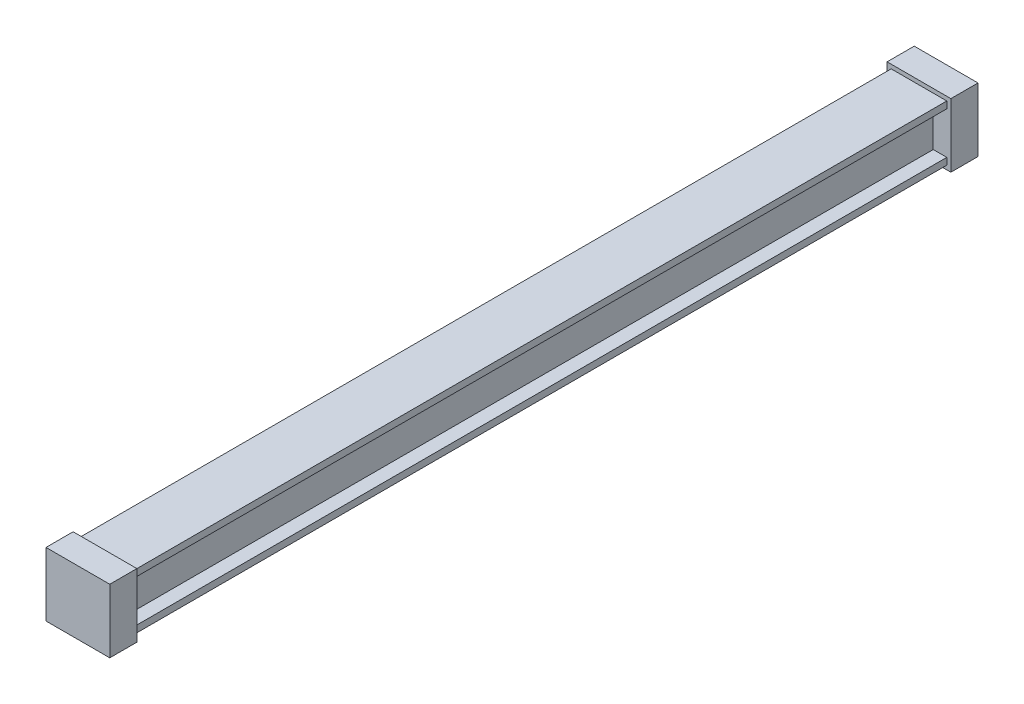
ISO-10303-21;
HEADER;
FILE_DESCRIPTION(('STEP AP214'),'2;1');
FILE_NAME('part.step','',(''),(''),'','','');
FILE_SCHEMA(('AUTOMOTIVE_DESIGN { 1 0 10303 214 1 1 1 1 }'));
ENDSEC;
DATA;
#1=APPLICATION_CONTEXT('core data for automotive mechanical design processes');
#2=APPLICATION_PROTOCOL_DEFINITION('international standard','automotive_design',2000,#1);
#3=PRODUCT_CONTEXT('',#1,'mechanical');
#4=PRODUCT('Part','Part','',(#3));
#5=PRODUCT_RELATED_PRODUCT_CATEGORY('part','',(#4));
#6=PRODUCT_DEFINITION_FORMATION('','',#4);
#7=PRODUCT_DEFINITION_CONTEXT('part definition',#1,'design');
#8=PRODUCT_DEFINITION('design','',#6,#7);
#9=PRODUCT_DEFINITION_SHAPE('','',#8);
#10=(LENGTH_UNIT() NAMED_UNIT(*) SI_UNIT(.MILLI.,.METRE.));
#11=(NAMED_UNIT(*) PLANE_ANGLE_UNIT() SI_UNIT($,.RADIAN.));
#12=(NAMED_UNIT(*) SI_UNIT($,.STERADIAN.) SOLID_ANGLE_UNIT());
#13=UNCERTAINTY_MEASURE_WITH_UNIT(LENGTH_MEASURE(1.E-05),#10,'distance_accuracy_value','');
#14=(GEOMETRIC_REPRESENTATION_CONTEXT(3) GLOBAL_UNCERTAINTY_ASSIGNED_CONTEXT((#13)) GLOBAL_UNIT_ASSIGNED_CONTEXT((#10,
#11,#12)) REPRESENTATION_CONTEXT('',''));
#15=CARTESIAN_POINT('',(0.,0.,0.));
#16=DIRECTION('',(0.,0.,1.));
#17=DIRECTION('',(1.,0.,0.));
#18=AXIS2_PLACEMENT_3D('',#15,#16,#17);
#19=CARTESIAN_POINT('',(20.5,-20.5,640.));
#20=DIRECTION('',(-1.,0.,0.));
#21=DIRECTION('',(0.,0.,1.));
#22=AXIS2_PLACEMENT_3D('',#19,#20,#21);
#23=PLANE('',#22);
#24=DIRECTION('',(0.,1.,0.));
#25=VECTOR('',#24,1.);
#26=CARTESIAN_POINT('',(20.5,-20.5,620.));
#27=LINE('',#26,#25);
#28=CARTESIAN_POINT('',(20.5,15.5,620.));
#29=VERTEX_POINT('',#28);
#30=CARTESIAN_POINT('',(20.5,20.5,620.));
#31=VERTEX_POINT('',#30);
#32=EDGE_CURVE('E59',#29,#31,#27,.T.);
#33=ORIENTED_EDGE('',*,*,#32,.F.);
#34=DIRECTION('',(0.,0.,1.));
#35=VECTOR('',#34,1.);
#36=CARTESIAN_POINT('',(20.5,15.5,620.));
#37=LINE('',#36,#35);
#38=CARTESIAN_POINT('',(20.5,15.5,20.));
#39=VERTEX_POINT('',#38);
#40=EDGE_CURVE('E52',#39,#29,#37,.T.);
#41=ORIENTED_EDGE('',*,*,#40,.F.);
#42=DIRECTION('',(0.,-1.,0.));
#43=VECTOR('',#42,1.);
#44=CARTESIAN_POINT('',(20.5,-20.5,20.));
#45=LINE('',#44,#43);
#46=CARTESIAN_POINT('',(20.5,20.5,20.));
#47=VERTEX_POINT('',#46);
#48=EDGE_CURVE('E261',#47,#39,#45,.T.);
#49=ORIENTED_EDGE('',*,*,#48,.F.);
#50=DIRECTION('',(0.,0.,-1.));
#51=VECTOR('',#50,1.);
#52=CARTESIAN_POINT('',(20.5,20.5,640.));
#53=LINE('',#52,#51);
#54=EDGE_CURVE('E271',#31,#47,#53,.T.);
#55=ORIENTED_EDGE('',*,*,#54,.F.);
#56=EDGE_LOOP('',(#33,#41,#49,#55));
#57=FACE_BOUND('',#56,.T.);
#58=ADVANCED_FACE('F37',(#57),#23,.F.);
#59=CARTESIAN_POINT('',(20.5,-15.4999999999998,20.));
#60=VERTEX_POINT('',#59);
#61=CARTESIAN_POINT('',(20.5,-20.5,20.));
#62=VERTEX_POINT('',#61);
#63=EDGE_CURVE('E260',#60,#62,#45,.T.);
#64=ORIENTED_EDGE('',*,*,#63,.F.);
#65=DIRECTION('',(0.,0.,-1.));
#66=VECTOR('',#65,1.);
#67=CARTESIAN_POINT('',(20.5,-15.5,620.));
#68=LINE('',#67,#66);
#69=CARTESIAN_POINT('',(20.5,-15.5,620.));
#70=VERTEX_POINT('',#69);
#71=EDGE_CURVE('E175',#70,#60,#68,.T.);
#72=ORIENTED_EDGE('',*,*,#71,.F.);
#73=CARTESIAN_POINT('',(20.5,-20.5,620.));
#74=VERTEX_POINT('',#73);
#75=EDGE_CURVE('E157',#74,#70,#27,.T.);
#76=ORIENTED_EDGE('',*,*,#75,.F.);
#77=DIRECTION('',(0.,0.,-1.));
#78=VECTOR('',#77,1.);
#79=CARTESIAN_POINT('',(20.5,-20.5,640.));
#80=LINE('',#79,#78);
#81=EDGE_CURVE('E264',#74,#62,#80,.T.);
#82=ORIENTED_EDGE('',*,*,#81,.T.);
#83=EDGE_LOOP('',(#64,#72,#76,#82));
#84=FACE_BOUND('',#83,.T.);
#85=ADVANCED_FACE('F39',(#84),#23,.F.);
#86=CARTESIAN_POINT('',(-20.5,20.5,640.));
#87=DIRECTION('',(0.,-1.,0.));
#88=DIRECTION('',(0.,0.,-1.));
#89=AXIS2_PLACEMENT_3D('',#86,#87,#88);
#90=PLANE('',#89);
#91=DIRECTION('',(-1.,0.,0.));
#92=VECTOR('',#91,1.);
#93=CARTESIAN_POINT('',(-20.5,20.5,620.));
#94=LINE('',#93,#92);
#95=CARTESIAN_POINT('',(-20.5,20.5,620.));
#96=VERTEX_POINT('',#95);
#97=EDGE_CURVE('E219',#31,#96,#94,.T.);
#98=ORIENTED_EDGE('',*,*,#97,.F.);
#99=ORIENTED_EDGE('',*,*,#54,.T.);
#100=DIRECTION('',(1.,0.,0.));
#101=VECTOR('',#100,1.);
#102=CARTESIAN_POINT('',(-20.5,20.5,20.));
#103=LINE('',#102,#101);
#104=CARTESIAN_POINT('',(-20.5,20.5,20.));
#105=VERTEX_POINT('',#104);
#106=EDGE_CURVE('E257',#105,#47,#103,.T.);
#107=ORIENTED_EDGE('',*,*,#106,.F.);
#108=DIRECTION('',(0.,0.,-1.));
#109=VECTOR('',#108,1.);
#110=CARTESIAN_POINT('',(-20.5,20.5,640.));
#111=LINE('',#110,#109);
#112=EDGE_CURVE('E269',#96,#105,#111,.T.);
#113=ORIENTED_EDGE('',*,*,#112,.F.);
#114=EDGE_LOOP('',(#98,#99,#107,#113));
#115=FACE_BOUND('',#114,.T.);
#116=ADVANCED_FACE('F286',(#115),#90,.F.);
#117=CARTESIAN_POINT('',(-20.5,-20.5,640.));
#118=DIRECTION('',(1.,0.,0.));
#119=DIRECTION('',(0.,0.,-1.));
#120=AXIS2_PLACEMENT_3D('',#117,#118,#119);
#121=PLANE('',#120);
#122=DIRECTION('',(0.,-1.,0.));
#123=VECTOR('',#122,1.);
#124=CARTESIAN_POINT('',(-20.5,-20.5,620.));
#125=LINE('',#124,#123);
#126=CARTESIAN_POINT('',(-20.5,-20.5,620.));
#127=VERTEX_POINT('',#126);
#128=EDGE_CURVE('E208',#96,#127,#125,.T.);
#129=ORIENTED_EDGE('',*,*,#128,.F.);
#130=ORIENTED_EDGE('',*,*,#112,.T.);
#131=DIRECTION('',(0.,1.,0.));
#132=VECTOR('',#131,1.);
#133=CARTESIAN_POINT('',(-20.5,-20.5,20.));
#134=LINE('',#133,#132);
#135=CARTESIAN_POINT('',(-20.5,-20.5,20.));
#136=VERTEX_POINT('',#135);
#137=EDGE_CURVE('E249',#136,#105,#134,.T.);
#138=ORIENTED_EDGE('',*,*,#137,.F.);
#139=DIRECTION('',(0.,0.,-1.));
#140=VECTOR('',#139,1.);
#141=CARTESIAN_POINT('',(-20.5,-20.5,640.));
#142=LINE('',#141,#140);
#143=EDGE_CURVE('E267',#127,#136,#142,.T.);
#144=ORIENTED_EDGE('',*,*,#143,.F.);
#145=EDGE_LOOP('',(#129,#130,#138,#144));
#146=FACE_BOUND('',#145,.T.);
#147=ADVANCED_FACE('F282',(#146),#121,.F.);
#148=CARTESIAN_POINT('',(-20.5,-20.5,640.));
#149=DIRECTION('',(0.,1.,0.));
#150=DIRECTION('',(0.,0.,1.));
#151=AXIS2_PLACEMENT_3D('',#148,#149,#150);
#152=PLANE('',#151);
#153=DIRECTION('',(1.,0.,0.));
#154=VECTOR('',#153,1.);
#155=CARTESIAN_POINT('',(-20.5,-20.5,620.));
#156=LINE('',#155,#154);
#157=EDGE_CURVE('E11',#127,#74,#156,.T.);
#158=ORIENTED_EDGE('',*,*,#157,.F.);
#159=ORIENTED_EDGE('',*,*,#143,.T.);
#160=DIRECTION('',(-1.,0.,0.));
#161=VECTOR('',#160,1.);
#162=CARTESIAN_POINT('',(-20.5,-20.5,20.));
#163=LINE('',#162,#161);
#164=EDGE_CURVE('E45',#62,#136,#163,.T.);
#165=ORIENTED_EDGE('',*,*,#164,.F.);
#166=ORIENTED_EDGE('',*,*,#81,.F.);
#167=EDGE_LOOP('',(#158,#159,#165,#166));
#168=FACE_BOUND('',#167,.T.);
#169=ADVANCED_FACE('F279',(#168),#152,.F.);
#170=CARTESIAN_POINT('',(0.,0.,20.));
#171=DIRECTION('',(0.,0.,-1.));
#172=DIRECTION('',(-1.,0.,0.));
#173=AXIS2_PLACEMENT_3D('',#170,#171,#172);
#174=PLANE('',#173);
#175=DIRECTION('',(0.,-1.,0.));
#176=VECTOR('',#175,1.);
#177=CARTESIAN_POINT('',(23.5,-23.5,20.));
#178=LINE('',#177,#176);
#179=CARTESIAN_POINT('',(23.5,23.5,20.));
#180=VERTEX_POINT('',#179);
#181=CARTESIAN_POINT('',(23.5,-23.5,20.));
#182=VERTEX_POINT('',#181);
#183=EDGE_CURVE('E223',#180,#182,#178,.T.);
#184=ORIENTED_EDGE('',*,*,#183,.F.);
#185=DIRECTION('',(1.,0.,0.));
#186=VECTOR('',#185,1.);
#187=CARTESIAN_POINT('',(-23.5,23.5,20.));
#188=LINE('',#187,#186);
#189=CARTESIAN_POINT('',(-23.5,23.5,20.));
#190=VERTEX_POINT('',#189);
#191=EDGE_CURVE('E233',#190,#180,#188,.T.);
#192=ORIENTED_EDGE('',*,*,#191,.F.);
#193=DIRECTION('',(0.,1.,0.));
#194=VECTOR('',#193,1.);
#195=CARTESIAN_POINT('',(-23.5,-23.5,20.));
#196=LINE('',#195,#194);
#197=CARTESIAN_POINT('',(-23.5,-23.5,20.));
#198=VERTEX_POINT('',#197);
#199=EDGE_CURVE('E230',#198,#190,#196,.T.);
#200=ORIENTED_EDGE('',*,*,#199,.F.);
#201=DIRECTION('',(-1.,0.,0.));
#202=VECTOR('',#201,1.);
#203=CARTESIAN_POINT('',(-23.5,-23.5,20.));
#204=LINE('',#203,#202);
#205=EDGE_CURVE('E226',#182,#198,#204,.T.);
#206=ORIENTED_EDGE('',*,*,#205,.F.);
#207=EDGE_LOOP('',(#184,#192,#200,#206));
#208=FACE_BOUND('',#207,.T.);
#209=ORIENTED_EDGE('',*,*,#106,.T.);
#210=ORIENTED_EDGE('',*,*,#48,.T.);
#211=DIRECTION('',(1.,0.,0.));
#212=VECTOR('',#211,1.);
#213=CARTESIAN_POINT('',(10.5,15.5,20.));
#214=LINE('',#213,#212);
#215=CARTESIAN_POINT('',(10.5,15.5,20.));
#216=VERTEX_POINT('',#215);
#217=EDGE_CURVE('E184',#216,#39,#214,.T.);
#218=ORIENTED_EDGE('',*,*,#217,.F.);
#219=DIRECTION('',(0.,1.,0.));
#220=VECTOR('',#219,1.);
#221=CARTESIAN_POINT('',(10.5,-15.4999999999998,20.));
#222=LINE('',#221,#220);
#223=CARTESIAN_POINT('',(10.5,-15.4999999999998,20.));
#224=VERTEX_POINT('',#223);
#225=EDGE_CURVE('E170',#224,#216,#222,.T.);
#226=ORIENTED_EDGE('',*,*,#225,.F.);
#227=DIRECTION('',(1.,0.,0.));
#228=VECTOR('',#227,1.);
#229=CARTESIAN_POINT('',(10.5,-15.4999999999998,20.));
#230=LINE('',#229,#228);
#231=EDGE_CURVE('E161',#224,#60,#230,.T.);
#232=ORIENTED_EDGE('',*,*,#231,.T.);
#233=ORIENTED_EDGE('',*,*,#63,.T.);
#234=ORIENTED_EDGE('',*,*,#164,.T.);
#235=ORIENTED_EDGE('',*,*,#137,.T.);
#236=EDGE_LOOP('',(#209,#210,#218,#226,#232,#233,#234,#235));
#237=FACE_BOUND('',#236,.T.);
#238=ADVANCED_FACE('F275',(#208,#237),#174,.F.);
#239=CARTESIAN_POINT('',(23.5,-23.5,20.));
#240=DIRECTION('',(1.,0.,0.));
#241=DIRECTION('',(0.,0.,-1.));
#242=AXIS2_PLACEMENT_3D('',#239,#240,#241);
#243=PLANE('',#242);
#244=DIRECTION('',(0.,-1.,0.));
#245=VECTOR('',#244,1.);
#246=CARTESIAN_POINT('',(23.5,-23.5,0.));
#247=LINE('',#246,#245);
#248=CARTESIAN_POINT('',(23.5,23.5,0.));
#249=VERTEX_POINT('',#248);
#250=CARTESIAN_POINT('',(23.5,-23.5,0.));
#251=VERTEX_POINT('',#250);
#252=EDGE_CURVE('E222',#249,#251,#247,.T.);
#253=ORIENTED_EDGE('',*,*,#252,.F.);
#254=DIRECTION('',(0.,0.,-1.));
#255=VECTOR('',#254,1.);
#256=CARTESIAN_POINT('',(23.5,23.5,20.));
#257=LINE('',#256,#255);
#258=EDGE_CURVE('E247',#180,#249,#257,.T.);
#259=ORIENTED_EDGE('',*,*,#258,.F.);
#260=ORIENTED_EDGE('',*,*,#183,.T.);
#261=DIRECTION('',(0.,0.,-1.));
#262=VECTOR('',#261,1.);
#263=CARTESIAN_POINT('',(23.5,-23.5,20.));
#264=LINE('',#263,#262);
#265=EDGE_CURVE('E236',#182,#251,#264,.T.);
#266=ORIENTED_EDGE('',*,*,#265,.T.);
#267=EDGE_LOOP('',(#253,#259,#260,#266));
#268=FACE_BOUND('',#267,.T.);
#269=ADVANCED_FACE('F316',(#268),#243,.T.);
#270=CARTESIAN_POINT('',(-23.5,23.5,20.));
#271=DIRECTION('',(0.,1.,0.));
#272=DIRECTION('',(0.,0.,1.));
#273=AXIS2_PLACEMENT_3D('',#270,#271,#272);
#274=PLANE('',#273);
#275=DIRECTION('',(1.,0.,0.));
#276=VECTOR('',#275,1.);
#277=CARTESIAN_POINT('',(-23.5,23.5,0.));
#278=LINE('',#277,#276);
#279=CARTESIAN_POINT('',(-23.5,23.5,0.));
#280=VERTEX_POINT('',#279);
#281=EDGE_CURVE('E227',#280,#249,#278,.T.);
#282=ORIENTED_EDGE('',*,*,#281,.F.);
#283=DIRECTION('',(0.,0.,-1.));
#284=VECTOR('',#283,1.);
#285=CARTESIAN_POINT('',(-23.5,23.5,20.));
#286=LINE('',#285,#284);
#287=EDGE_CURVE('E250',#190,#280,#286,.T.);
#288=ORIENTED_EDGE('',*,*,#287,.F.);
#289=ORIENTED_EDGE('',*,*,#191,.T.);
#290=ORIENTED_EDGE('',*,*,#258,.T.);
#291=EDGE_LOOP('',(#282,#288,#289,#290));
#292=FACE_BOUND('',#291,.T.);
#293=ADVANCED_FACE('F319',(#292),#274,.T.);
#294=CARTESIAN_POINT('',(-23.5,-23.5,20.));
#295=DIRECTION('',(-1.,0.,0.));
#296=DIRECTION('',(0.,0.,1.));
#297=AXIS2_PLACEMENT_3D('',#294,#295,#296);
#298=PLANE('',#297);
#299=DIRECTION('',(0.,1.,0.));
#300=VECTOR('',#299,1.);
#301=CARTESIAN_POINT('',(-23.5,-23.5,0.));
#302=LINE('',#301,#300);
#303=CARTESIAN_POINT('',(-23.5,-23.5,0.));
#304=VERTEX_POINT('',#303);
#305=EDGE_CURVE('E242',#304,#280,#302,.T.);
#306=ORIENTED_EDGE('',*,*,#305,.F.);
#307=DIRECTION('',(0.,0.,-1.));
#308=VECTOR('',#307,1.);
#309=CARTESIAN_POINT('',(-23.5,-23.5,20.));
#310=LINE('',#309,#308);
#311=EDGE_CURVE('E252',#198,#304,#310,.T.);
#312=ORIENTED_EDGE('',*,*,#311,.F.);
#313=ORIENTED_EDGE('',*,*,#199,.T.);
#314=ORIENTED_EDGE('',*,*,#287,.T.);
#315=EDGE_LOOP('',(#306,#312,#313,#314));
#316=FACE_BOUND('',#315,.T.);
#317=ADVANCED_FACE('F323',(#316),#298,.T.);
#318=CARTESIAN_POINT('',(-23.5,-23.5,20.));
#319=DIRECTION('',(0.,-1.,0.));
#320=DIRECTION('',(0.,0.,-1.));
#321=AXIS2_PLACEMENT_3D('',#318,#319,#320);
#322=PLANE('',#321);
#323=DIRECTION('',(-1.,0.,0.));
#324=VECTOR('',#323,1.);
#325=CARTESIAN_POINT('',(-23.5,-23.5,0.));
#326=LINE('',#325,#324);
#327=EDGE_CURVE('E239',#251,#304,#326,.T.);
#328=ORIENTED_EDGE('',*,*,#327,.F.);
#329=ORIENTED_EDGE('',*,*,#265,.F.);
#330=ORIENTED_EDGE('',*,*,#205,.T.);
#331=ORIENTED_EDGE('',*,*,#311,.T.);
#332=EDGE_LOOP('',(#328,#329,#330,#331));
#333=FACE_BOUND('',#332,.T.);
#334=ADVANCED_FACE('F308',(#333),#322,.T.);
#335=CARTESIAN_POINT('',(0.,0.,0.));
#336=DIRECTION('',(0.,0.,-1.));
#337=DIRECTION('',(-1.,0.,0.));
#338=AXIS2_PLACEMENT_3D('',#335,#336,#337);
#339=PLANE('',#338);
#340=ORIENTED_EDGE('',*,*,#252,.T.);
#341=ORIENTED_EDGE('',*,*,#327,.T.);
#342=ORIENTED_EDGE('',*,*,#305,.T.);
#343=ORIENTED_EDGE('',*,*,#281,.T.);
#344=EDGE_LOOP('',(#340,#341,#342,#343));
#345=FACE_BOUND('',#344,.T.);
#346=ADVANCED_FACE('F305',(#345),#339,.T.);
#347=CARTESIAN_POINT('',(0.,0.,620.));
#348=DIRECTION('',(0.,0.,1.));
#349=DIRECTION('',(-1.,0.,0.));
#350=AXIS2_PLACEMENT_3D('',#347,#348,#349);
#351=PLANE('',#350);
#352=DIRECTION('',(0.,-1.,0.));
#353=VECTOR('',#352,1.);
#354=CARTESIAN_POINT('',(23.5,-23.5,620.));
#355=LINE('',#354,#353);
#356=CARTESIAN_POINT('',(23.5,23.5,620.));
#357=VERTEX_POINT('',#356);
#358=CARTESIAN_POINT('',(23.5,-23.5,620.));
#359=VERTEX_POINT('',#358);
#360=EDGE_CURVE('E187',#357,#359,#355,.T.);
#361=ORIENTED_EDGE('',*,*,#360,.T.);
#362=DIRECTION('',(-1.,0.,0.));
#363=VECTOR('',#362,1.);
#364=CARTESIAN_POINT('',(-23.5,-23.5,620.));
#365=LINE('',#364,#363);
#366=CARTESIAN_POINT('',(-23.5,-23.5,620.));
#367=VERTEX_POINT('',#366);
#368=EDGE_CURVE('E195',#359,#367,#365,.T.);
#369=ORIENTED_EDGE('',*,*,#368,.T.);
#370=DIRECTION('',(0.,1.,0.));
#371=VECTOR('',#370,1.);
#372=CARTESIAN_POINT('',(-23.5,-23.5,620.));
#373=LINE('',#372,#371);
#374=CARTESIAN_POINT('',(-23.5,23.5,620.));
#375=VERTEX_POINT('',#374);
#376=EDGE_CURVE('E193',#367,#375,#373,.T.);
#377=ORIENTED_EDGE('',*,*,#376,.T.);
#378=DIRECTION('',(1.,0.,0.));
#379=VECTOR('',#378,1.);
#380=CARTESIAN_POINT('',(-23.5,23.5,620.));
#381=LINE('',#380,#379);
#382=EDGE_CURVE('E190',#375,#357,#381,.T.);
#383=ORIENTED_EDGE('',*,*,#382,.T.);
#384=EDGE_LOOP('',(#361,#369,#377,#383));
#385=FACE_BOUND('',#384,.T.);
#386=ORIENTED_EDGE('',*,*,#157,.T.);
#387=ORIENTED_EDGE('',*,*,#75,.T.);
#388=DIRECTION('',(1.,0.,0.));
#389=VECTOR('',#388,1.);
#390=CARTESIAN_POINT('',(10.5,-15.5,620.));
#391=LINE('',#390,#389);
#392=CARTESIAN_POINT('',(10.5,-15.5,620.));
#393=VERTEX_POINT('',#392);
#394=EDGE_CURVE('E150',#393,#70,#391,.T.);
#395=ORIENTED_EDGE('',*,*,#394,.F.);
#396=DIRECTION('',(0.,-1.,0.));
#397=VECTOR('',#396,1.);
#398=CARTESIAN_POINT('',(10.5,-15.5,620.));
#399=LINE('',#398,#397);
#400=CARTESIAN_POINT('',(10.5,15.5,620.));
#401=VERTEX_POINT('',#400);
#402=EDGE_CURVE('E154',#401,#393,#399,.T.);
#403=ORIENTED_EDGE('',*,*,#402,.F.);
#404=DIRECTION('',(1.,0.,0.));
#405=VECTOR('',#404,1.);
#406=CARTESIAN_POINT('',(10.5,15.5,620.));
#407=LINE('',#406,#405);
#408=EDGE_CURVE('E181',#401,#29,#407,.T.);
#409=ORIENTED_EDGE('',*,*,#408,.T.);
#410=ORIENTED_EDGE('',*,*,#32,.T.);
#411=ORIENTED_EDGE('',*,*,#97,.T.);
#412=ORIENTED_EDGE('',*,*,#128,.T.);
#413=EDGE_LOOP('',(#386,#387,#395,#403,#409,#410,#411,#412));
#414=FACE_BOUND('',#413,.T.);
#415=ADVANCED_FACE('F152',(#385,#414),#351,.F.);
#416=CARTESIAN_POINT('',(23.5,-23.5,620.));
#417=DIRECTION('',(-1.,0.,0.));
#418=DIRECTION('',(0.,0.,1.));
#419=AXIS2_PLACEMENT_3D('',#416,#417,#418);
#420=PLANE('',#419);
#421=DIRECTION('',(0.,-1.,0.));
#422=VECTOR('',#421,1.);
#423=CARTESIAN_POINT('',(23.5,-23.5,640.));
#424=LINE('',#423,#422);
#425=CARTESIAN_POINT('',(23.5,23.5,640.));
#426=VERTEX_POINT('',#425);
#427=CARTESIAN_POINT('',(23.5,-23.5,640.));
#428=VERTEX_POINT('',#427);
#429=EDGE_CURVE('E183',#426,#428,#424,.T.);
#430=ORIENTED_EDGE('',*,*,#429,.T.);
#431=DIRECTION('',(0.,0.,1.));
#432=VECTOR('',#431,1.);
#433=CARTESIAN_POINT('',(23.5,-23.5,620.));
#434=LINE('',#433,#432);
#435=EDGE_CURVE('E205',#359,#428,#434,.T.);
#436=ORIENTED_EDGE('',*,*,#435,.F.);
#437=ORIENTED_EDGE('',*,*,#360,.F.);
#438=DIRECTION('',(0.,0.,1.));
#439=VECTOR('',#438,1.);
#440=CARTESIAN_POINT('',(23.5,23.5,620.));
#441=LINE('',#440,#439);
#442=EDGE_CURVE('E197',#357,#426,#441,.T.);
#443=ORIENTED_EDGE('',*,*,#442,.T.);
#444=EDGE_LOOP('',(#430,#436,#437,#443));
#445=FACE_BOUND('',#444,.T.);
#446=ADVANCED_FACE('F334',(#445),#420,.F.);
#447=CARTESIAN_POINT('',(-23.5,-23.5,620.));
#448=DIRECTION('',(0.,1.,0.));
#449=DIRECTION('',(0.,0.,1.));
#450=AXIS2_PLACEMENT_3D('',#447,#448,#449);
#451=PLANE('',#450);
#452=DIRECTION('',(-1.,0.,0.));
#453=VECTOR('',#452,1.);
#454=CARTESIAN_POINT('',(-23.5,-23.5,640.));
#455=LINE('',#454,#453);
#456=CARTESIAN_POINT('',(-23.5,-23.5,640.));
#457=VERTEX_POINT('',#456);
#458=EDGE_CURVE('E191',#428,#457,#455,.T.);
#459=ORIENTED_EDGE('',*,*,#458,.T.);
#460=DIRECTION('',(0.,0.,1.));
#461=VECTOR('',#460,1.);
#462=CARTESIAN_POINT('',(-23.5,-23.5,620.));
#463=LINE('',#462,#461);
#464=EDGE_CURVE('E209',#367,#457,#463,.T.);
#465=ORIENTED_EDGE('',*,*,#464,.F.);
#466=ORIENTED_EDGE('',*,*,#368,.F.);
#467=ORIENTED_EDGE('',*,*,#435,.T.);
#468=EDGE_LOOP('',(#459,#465,#466,#467));
#469=FACE_BOUND('',#468,.T.);
#470=ADVANCED_FACE('F337',(#469),#451,.F.);
#471=CARTESIAN_POINT('',(-23.5,-23.5,620.));
#472=DIRECTION('',(1.,0.,0.));
#473=DIRECTION('',(0.,0.,-1.));
#474=AXIS2_PLACEMENT_3D('',#471,#472,#473);
#475=PLANE('',#474);
#476=DIRECTION('',(0.,1.,0.));
#477=VECTOR('',#476,1.);
#478=CARTESIAN_POINT('',(-23.5,-23.5,640.));
#479=LINE('',#478,#477);
#480=CARTESIAN_POINT('',(-23.5,23.5,640.));
#481=VERTEX_POINT('',#480);
#482=EDGE_CURVE('E202',#457,#481,#479,.T.);
#483=ORIENTED_EDGE('',*,*,#482,.T.);
#484=DIRECTION('',(0.,0.,1.));
#485=VECTOR('',#484,1.);
#486=CARTESIAN_POINT('',(-23.5,23.5,620.));
#487=LINE('',#486,#485);
#488=EDGE_CURVE('E212',#375,#481,#487,.T.);
#489=ORIENTED_EDGE('',*,*,#488,.F.);
#490=ORIENTED_EDGE('',*,*,#376,.F.);
#491=ORIENTED_EDGE('',*,*,#464,.T.);
#492=EDGE_LOOP('',(#483,#489,#490,#491));
#493=FACE_BOUND('',#492,.T.);
#494=ADVANCED_FACE('F341',(#493),#475,.F.);
#495=CARTESIAN_POINT('',(-23.5,23.5,620.));
#496=DIRECTION('',(0.,-1.,0.));
#497=DIRECTION('',(0.,0.,-1.));
#498=AXIS2_PLACEMENT_3D('',#495,#496,#497);
#499=PLANE('',#498);
#500=DIRECTION('',(1.,0.,0.));
#501=VECTOR('',#500,1.);
#502=CARTESIAN_POINT('',(-23.5,23.5,640.));
#503=LINE('',#502,#501);
#504=EDGE_CURVE('E200',#481,#426,#503,.T.);
#505=ORIENTED_EDGE('',*,*,#504,.T.);
#506=ORIENTED_EDGE('',*,*,#442,.F.);
#507=ORIENTED_EDGE('',*,*,#382,.F.);
#508=ORIENTED_EDGE('',*,*,#488,.T.);
#509=EDGE_LOOP('',(#505,#506,#507,#508));
#510=FACE_BOUND('',#509,.T.);
#511=ADVANCED_FACE('F314',(#510),#499,.F.);
#512=CARTESIAN_POINT('',(0.,0.,640.));
#513=DIRECTION('',(0.,0.,-1.));
#514=DIRECTION('',(-1.,0.,0.));
#515=AXIS2_PLACEMENT_3D('',#512,#513,#514);
#516=PLANE('',#515);
#517=ORIENTED_EDGE('',*,*,#429,.F.);
#518=ORIENTED_EDGE('',*,*,#504,.F.);
#519=ORIENTED_EDGE('',*,*,#482,.F.);
#520=ORIENTED_EDGE('',*,*,#458,.F.);
#521=EDGE_LOOP('',(#517,#518,#519,#520));
#522=FACE_BOUND('',#521,.T.);
#523=ADVANCED_FACE('F310',(#522),#516,.F.);
#524=CARTESIAN_POINT('',(10.5,15.5,620.));
#525=DIRECTION('',(0.,1.,0.));
#526=DIRECTION('',(0.,0.,1.));
#527=AXIS2_PLACEMENT_3D('',#524,#525,#526);
#528=PLANE('',#527);
#529=ORIENTED_EDGE('',*,*,#40,.T.);
#530=ORIENTED_EDGE('',*,*,#408,.F.);
#531=DIRECTION('',(0.,0.,1.));
#532=VECTOR('',#531,1.);
#533=CARTESIAN_POINT('',(10.5,15.5,620.));
#534=LINE('',#533,#532);
#535=EDGE_CURVE('E162',#216,#401,#534,.T.);
#536=ORIENTED_EDGE('',*,*,#535,.F.);
#537=ORIENTED_EDGE('',*,*,#217,.T.);
#538=EDGE_LOOP('',(#529,#530,#536,#537));
#539=FACE_BOUND('',#538,.T.);
#540=ADVANCED_FACE('F313',(#539),#528,.F.);
#541=CARTESIAN_POINT('',(10.5,-15.5,620.));
#542=DIRECTION('',(0.,-1.,0.));
#543=DIRECTION('',(0.,0.,-1.));
#544=AXIS2_PLACEMENT_3D('',#541,#542,#543);
#545=PLANE('',#544);
#546=ORIENTED_EDGE('',*,*,#71,.T.);
#547=ORIENTED_EDGE('',*,*,#231,.F.);
#548=DIRECTION('',(0.,0.,-1.));
#549=VECTOR('',#548,1.);
#550=CARTESIAN_POINT('',(10.5,-15.5,620.));
#551=LINE('',#550,#549);
#552=EDGE_CURVE('E165',#393,#224,#551,.T.);
#553=ORIENTED_EDGE('',*,*,#552,.F.);
#554=ORIENTED_EDGE('',*,*,#394,.T.);
#555=EDGE_LOOP('',(#546,#547,#553,#554));
#556=FACE_BOUND('',#555,.T.);
#557=ADVANCED_FACE('F166',(#556),#545,.F.);
#558=CARTESIAN_POINT('',(10.5,0.,0.));
#559=DIRECTION('',(-1.,0.,0.));
#560=DIRECTION('',(0.,0.,1.));
#561=AXIS2_PLACEMENT_3D('',#558,#559,#560);
#562=PLANE('',#561);
#563=ORIENTED_EDGE('',*,*,#402,.T.);
#564=ORIENTED_EDGE('',*,*,#552,.T.);
#565=ORIENTED_EDGE('',*,*,#225,.T.);
#566=ORIENTED_EDGE('',*,*,#535,.T.);
#567=EDGE_LOOP('',(#563,#564,#565,#566));
#568=FACE_BOUND('',#567,.T.);
#569=ADVANCED_FACE('F172',(#568),#562,.F.);
#570=CLOSED_SHELL('',(#58,#85,#116,#147,#169,#238,#269,#293,#317,#334,#346,#415,#446,#470,#494,
#511,#523,#540,#557,#569));
#571=MANIFOLD_SOLID_BREP('B2',#570);
#572=ADVANCED_BREP_SHAPE_REPRESENTATION('',(#18,#571),#14);
#573=SHAPE_DEFINITION_REPRESENTATION(#9,#572);
ENDSEC;
END-ISO-10303-21;
